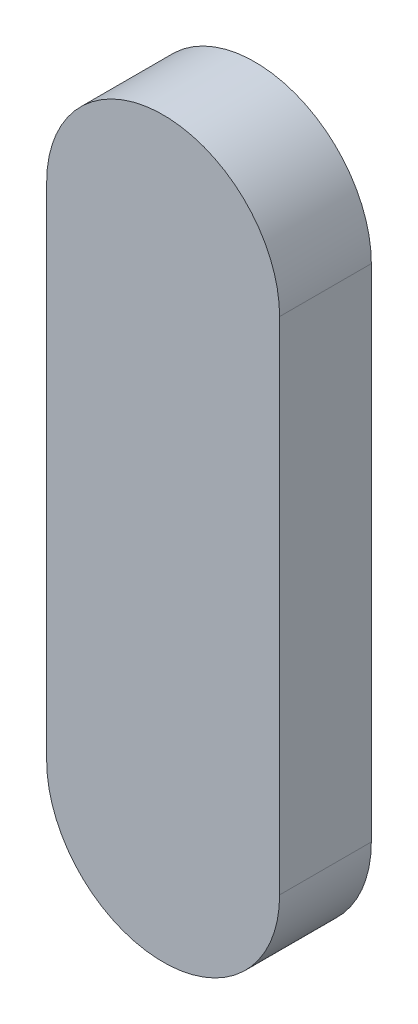
ISO-10303-21;
HEADER;
FILE_DESCRIPTION(('STEP AP214'),'2;1');
FILE_NAME('part.step','',(''),(''),'','','');
FILE_SCHEMA(('AUTOMOTIVE_DESIGN { 1 0 10303 214 1 1 1 1 }'));
ENDSEC;
DATA;
#1=APPLICATION_CONTEXT('core data for automotive mechanical design processes');
#2=APPLICATION_PROTOCOL_DEFINITION('international standard','automotive_design',2000,#1);
#3=PRODUCT_CONTEXT('',#1,'mechanical');
#4=PRODUCT('Part','Part','',(#3));
#5=PRODUCT_RELATED_PRODUCT_CATEGORY('part','',(#4));
#6=PRODUCT_DEFINITION_FORMATION('','',#4);
#7=PRODUCT_DEFINITION_CONTEXT('part definition',#1,'design');
#8=PRODUCT_DEFINITION('design','',#6,#7);
#9=PRODUCT_DEFINITION_SHAPE('','',#8);
#10=(LENGTH_UNIT() NAMED_UNIT(*) SI_UNIT(.MILLI.,.METRE.));
#11=(NAMED_UNIT(*) PLANE_ANGLE_UNIT() SI_UNIT($,.RADIAN.));
#12=(NAMED_UNIT(*) SI_UNIT($,.STERADIAN.) SOLID_ANGLE_UNIT());
#13=UNCERTAINTY_MEASURE_WITH_UNIT(LENGTH_MEASURE(1.E-05),#10,'distance_accuracy_value','');
#14=(GEOMETRIC_REPRESENTATION_CONTEXT(3) GLOBAL_UNCERTAINTY_ASSIGNED_CONTEXT((#13)) GLOBAL_UNIT_ASSIGNED_CONTEXT((#10,
#11,#12)) REPRESENTATION_CONTEXT('',''));
#15=CARTESIAN_POINT('',(0.,0.,0.));
#16=DIRECTION('',(0.,0.,1.));
#17=DIRECTION('',(1.,0.,0.));
#18=AXIS2_PLACEMENT_3D('',#15,#16,#17);
#19=CARTESIAN_POINT('',(99.8474,62.23,0.));
#20=DIRECTION('',(-1.,0.,0.));
#21=DIRECTION('',(0.,1.,0.));
#22=AXIS2_PLACEMENT_3D('',#19,#20,#21);
#23=PLANE('',#22);
#24=DIRECTION('',(0.,1.,0.));
#25=VECTOR('',#24,1.);
#26=CARTESIAN_POINT('',(99.8474,62.23,0.1999996));
#27=LINE('',#26,#25);
#28=CARTESIAN_POINT('',(99.8474,62.23,0.1999996));
#29=VERTEX_POINT('',#28);
#30=CARTESIAN_POINT('',(99.8474,63.3222,0.1999996));
#31=VERTEX_POINT('',#30);
#32=EDGE_CURVE('E11',#29,#31,#27,.T.);
#33=ORIENTED_EDGE('',*,*,#32,.F.);
#34=DIRECTION('',(0.,0.,1.));
#35=VECTOR('',#34,1.);
#36=CARTESIAN_POINT('',(99.8474,62.23,0.));
#37=LINE('',#36,#35);
#38=CARTESIAN_POINT('',(99.8474,62.23,0.));
#39=VERTEX_POINT('',#38);
#40=EDGE_CURVE('E24',#39,#29,#37,.T.);
#41=ORIENTED_EDGE('',*,*,#40,.F.);
#42=DIRECTION('',(0.,1.,0.));
#43=VECTOR('',#42,1.);
#44=CARTESIAN_POINT('',(99.8474,62.23,0.));
#45=LINE('',#44,#43);
#46=CARTESIAN_POINT('',(99.8474,63.3222,0.));
#47=VERTEX_POINT('',#46);
#48=EDGE_CURVE('E75',#39,#47,#45,.T.);
#49=ORIENTED_EDGE('',*,*,#48,.T.);
#50=DIRECTION('',(0.,0.,1.));
#51=VECTOR('',#50,1.);
#52=CARTESIAN_POINT('',(99.8474,63.3222,0.));
#53=LINE('',#52,#51);
#54=EDGE_CURVE('E37',#47,#31,#53,.T.);
#55=ORIENTED_EDGE('',*,*,#54,.T.);
#56=EDGE_LOOP('',(#33,#41,#49,#55));
#57=FACE_BOUND('',#56,.T.);
#58=ADVANCED_FACE('F17',(#57),#23,.F.);
#59=CARTESIAN_POINT('',(99.5934,63.3222,0.));
#60=DIRECTION('',(0.,0.,-1.));
#61=DIRECTION('',(1.,0.,0.));
#62=AXIS2_PLACEMENT_3D('',#59,#60,#61);
#63=CYLINDRICAL_SURFACE('',#62,0.253999999999998);
#64=CARTESIAN_POINT('',(99.5934,63.3222,0.1999996));
#65=DIRECTION('',(0.,0.,1.));
#66=DIRECTION('',(1.,0.,0.));
#67=AXIS2_PLACEMENT_3D('',#64,#65,#66);
#68=CIRCLE('',#67,0.253999999999998);
#69=CARTESIAN_POINT('',(99.3394,63.3222,0.1999996));
#70=VERTEX_POINT('',#69);
#71=EDGE_CURVE('E83',#31,#70,#68,.T.);
#72=ORIENTED_EDGE('',*,*,#71,.F.);
#73=ORIENTED_EDGE('',*,*,#54,.F.);
#74=CARTESIAN_POINT('',(99.5934,63.3222,0.));
#75=DIRECTION('',(0.,0.,1.));
#76=DIRECTION('',(1.,0.,0.));
#77=AXIS2_PLACEMENT_3D('',#74,#75,#76);
#78=CIRCLE('',#77,0.253999999999998);
#79=CARTESIAN_POINT('',(99.3394,63.3222,0.));
#80=VERTEX_POINT('',#79);
#81=EDGE_CURVE('E81',#47,#80,#78,.T.);
#82=ORIENTED_EDGE('',*,*,#81,.T.);
#83=DIRECTION('',(0.,0.,1.));
#84=VECTOR('',#83,1.);
#85=CARTESIAN_POINT('',(99.3394,63.3222,0.));
#86=LINE('',#85,#84);
#87=EDGE_CURVE('E67',#80,#70,#86,.T.);
#88=ORIENTED_EDGE('',*,*,#87,.T.);
#89=EDGE_LOOP('',(#72,#73,#82,#88));
#90=FACE_BOUND('',#89,.T.);
#91=ADVANCED_FACE('F89',(#90),#63,.T.);
#92=CARTESIAN_POINT('',(99.3394,63.3222,0.));
#93=DIRECTION('',(1.,0.,0.));
#94=DIRECTION('',(0.,-1.,0.));
#95=AXIS2_PLACEMENT_3D('',#92,#93,#94);
#96=PLANE('',#95);
#97=DIRECTION('',(0.,-1.,0.));
#98=VECTOR('',#97,1.);
#99=CARTESIAN_POINT('',(99.3394,63.3222,0.1999996));
#100=LINE('',#99,#98);
#101=CARTESIAN_POINT('',(99.3394,62.23,0.1999996));
#102=VERTEX_POINT('',#101);
#103=EDGE_CURVE('E71',#70,#102,#100,.T.);
#104=ORIENTED_EDGE('',*,*,#103,.F.);
#105=ORIENTED_EDGE('',*,*,#87,.F.);
#106=DIRECTION('',(0.,-1.,0.));
#107=VECTOR('',#106,1.);
#108=CARTESIAN_POINT('',(99.3394,63.3222,0.));
#109=LINE('',#108,#107);
#110=CARTESIAN_POINT('',(99.3394,62.23,0.));
#111=VERTEX_POINT('',#110);
#112=EDGE_CURVE('E63',#80,#111,#109,.T.);
#113=ORIENTED_EDGE('',*,*,#112,.T.);
#114=DIRECTION('',(0.,0.,1.));
#115=VECTOR('',#114,1.);
#116=CARTESIAN_POINT('',(99.3394,62.23,0.));
#117=LINE('',#116,#115);
#118=EDGE_CURVE('E53',#111,#102,#117,.T.);
#119=ORIENTED_EDGE('',*,*,#118,.T.);
#120=EDGE_LOOP('',(#104,#105,#113,#119));
#121=FACE_BOUND('',#120,.T.);
#122=ADVANCED_FACE('F66',(#121),#96,.F.);
#123=CARTESIAN_POINT('',(99.5934,62.23,0.));
#124=DIRECTION('',(0.,0.,-1.));
#125=DIRECTION('',(-1.,0.,0.));
#126=AXIS2_PLACEMENT_3D('',#123,#124,#125);
#127=CYLINDRICAL_SURFACE('',#126,0.253999999999998);
#128=CARTESIAN_POINT('',(99.5934,62.23,0.1999996));
#129=DIRECTION('',(0.,0.,1.));
#130=DIRECTION('',(-1.,0.,0.));
#131=AXIS2_PLACEMENT_3D('',#128,#129,#130);
#132=CIRCLE('',#131,0.253999999999998);
#133=EDGE_CURVE('E59',#102,#29,#132,.T.);
#134=ORIENTED_EDGE('',*,*,#133,.F.);
#135=ORIENTED_EDGE('',*,*,#118,.F.);
#136=CARTESIAN_POINT('',(99.5934,62.23,0.));
#137=DIRECTION('',(0.,0.,1.));
#138=DIRECTION('',(-1.,0.,0.));
#139=AXIS2_PLACEMENT_3D('',#136,#137,#138);
#140=CIRCLE('',#139,0.253999999999998);
#141=EDGE_CURVE('E57',#111,#39,#140,.T.);
#142=ORIENTED_EDGE('',*,*,#141,.T.);
#143=ORIENTED_EDGE('',*,*,#40,.T.);
#144=EDGE_LOOP('',(#134,#135,#142,#143));
#145=FACE_BOUND('',#144,.T.);
#146=ADVANCED_FACE('F55',(#145),#127,.T.);
#147=CARTESIAN_POINT('',(99.8474,62.23,0.));
#148=DIRECTION('',(0.,0.,-1.));
#149=DIRECTION('',(-1.,0.,0.));
#150=AXIS2_PLACEMENT_3D('',#147,#148,#149);
#151=PLANE('',#150);
#152=ORIENTED_EDGE('',*,*,#141,.F.);
#153=ORIENTED_EDGE('',*,*,#112,.F.);
#154=ORIENTED_EDGE('',*,*,#81,.F.);
#155=ORIENTED_EDGE('',*,*,#48,.F.);
#156=EDGE_LOOP('',(#152,#153,#154,#155));
#157=FACE_BOUND('',#156,.T.);
#158=ADVANCED_FACE('F74',(#157),#151,.T.);
#159=CARTESIAN_POINT('',(99.8474,62.23,0.1999996));
#160=DIRECTION('',(0.,0.,-1.));
#161=DIRECTION('',(-1.,0.,0.));
#162=AXIS2_PLACEMENT_3D('',#159,#160,#161);
#163=PLANE('',#162);
#164=ORIENTED_EDGE('',*,*,#32,.T.);
#165=ORIENTED_EDGE('',*,*,#71,.T.);
#166=ORIENTED_EDGE('',*,*,#103,.T.);
#167=ORIENTED_EDGE('',*,*,#133,.T.);
#168=EDGE_LOOP('',(#164,#165,#166,#167));
#169=FACE_BOUND('',#168,.T.);
#170=ADVANCED_FACE('F91',(#169),#163,.F.);
#171=CLOSED_SHELL('',(#58,#91,#122,#146,#158,#170));
#172=MANIFOLD_SOLID_BREP('B1',#171);
#173=ADVANCED_BREP_SHAPE_REPRESENTATION('',(#18,#172),#14);
#174=SHAPE_DEFINITION_REPRESENTATION(#9,#173);
ENDSEC;
END-ISO-10303-21;
